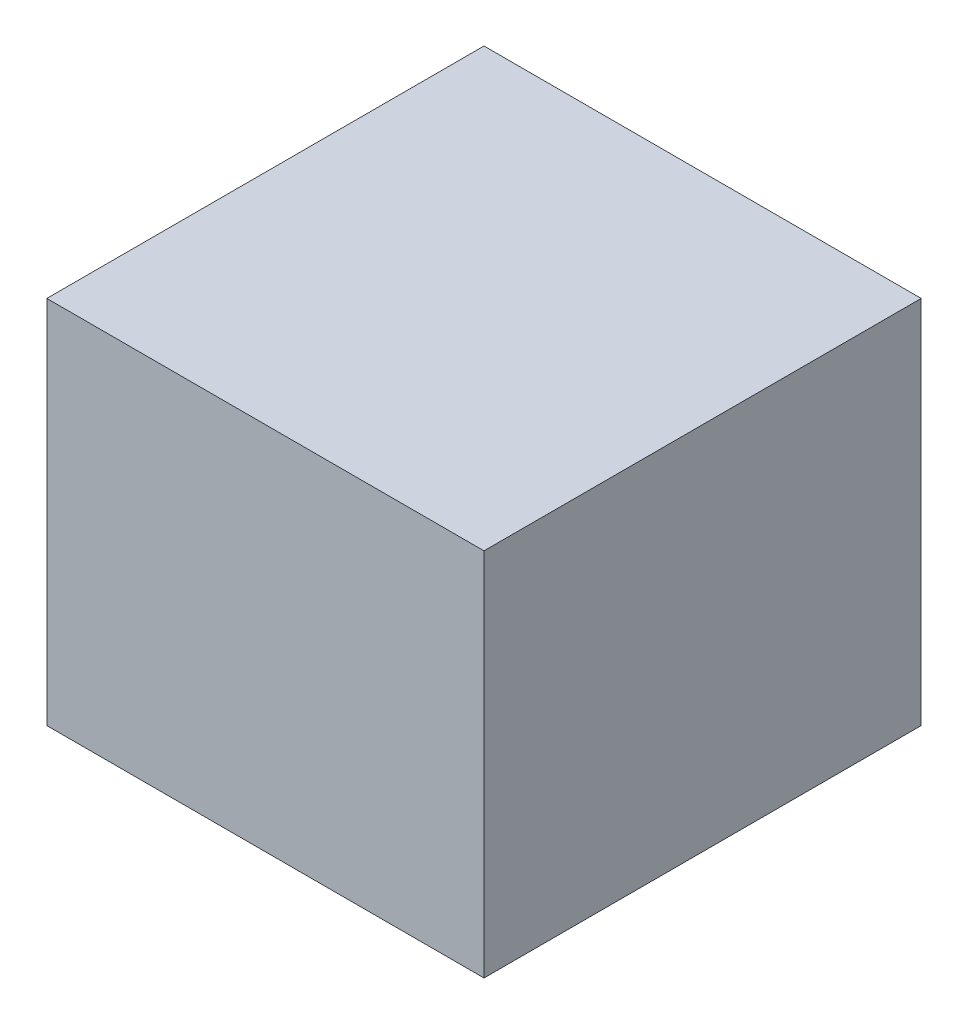
ISO-10303-21;
HEADER;
FILE_DESCRIPTION(('STEP AP214'),'2;1');
FILE_NAME('part.step','',(''),(''),'','','');
FILE_SCHEMA(('AUTOMOTIVE_DESIGN { 1 0 10303 214 1 1 1 1 }'));
ENDSEC;
DATA;
#1=APPLICATION_CONTEXT('core data for automotive mechanical design processes');
#2=APPLICATION_PROTOCOL_DEFINITION('international standard','automotive_design',2000,#1);
#3=PRODUCT_CONTEXT('',#1,'mechanical');
#4=PRODUCT('Part','Part','',(#3));
#5=PRODUCT_RELATED_PRODUCT_CATEGORY('part','',(#4));
#6=PRODUCT_DEFINITION_FORMATION('','',#4);
#7=PRODUCT_DEFINITION_CONTEXT('part definition',#1,'design');
#8=PRODUCT_DEFINITION('design','',#6,#7);
#9=PRODUCT_DEFINITION_SHAPE('','',#8);
#10=(LENGTH_UNIT() NAMED_UNIT(*) SI_UNIT(.MILLI.,.METRE.));
#11=(NAMED_UNIT(*) PLANE_ANGLE_UNIT() SI_UNIT($,.RADIAN.));
#12=(NAMED_UNIT(*) SI_UNIT($,.STERADIAN.) SOLID_ANGLE_UNIT());
#13=UNCERTAINTY_MEASURE_WITH_UNIT(LENGTH_MEASURE(1.E-05),#10,'distance_accuracy_value','');
#14=(GEOMETRIC_REPRESENTATION_CONTEXT(3) GLOBAL_UNCERTAINTY_ASSIGNED_CONTEXT((#13)) GLOBAL_UNIT_ASSIGNED_CONTEXT((#10,
#11,#12)) REPRESENTATION_CONTEXT('',''));
#15=CARTESIAN_POINT('',(0.,0.,0.));
#16=DIRECTION('',(0.,0.,1.));
#17=DIRECTION('',(1.,0.,0.));
#18=AXIS2_PLACEMENT_3D('',#15,#16,#17);
#19=CARTESIAN_POINT('',(0.,279.4,0.));
#20=DIRECTION('',(1.,0.,0.));
#21=DIRECTION('',(0.,0.,-1.));
#22=AXIS2_PLACEMENT_3D('',#19,#20,#21);
#23=PLANE('',#22);
#24=DIRECTION('',(0.,0.,1.));
#25=VECTOR('',#24,1.);
#26=CARTESIAN_POINT('',(0.,0.,0.));
#27=LINE('',#26,#25);
#28=CARTESIAN_POINT('',(0.,0.,-330.2));
#29=VERTEX_POINT('',#28);
#30=CARTESIAN_POINT('',(0.,0.,0.));
#31=VERTEX_POINT('',#30);
#32=EDGE_CURVE('E95',#29,#31,#27,.T.);
#33=ORIENTED_EDGE('',*,*,#32,.T.);
#34=DIRECTION('',(0.,-1.,0.));
#35=VECTOR('',#34,1.);
#36=CARTESIAN_POINT('',(0.,279.4,0.));
#37=LINE('',#36,#35);
#38=CARTESIAN_POINT('',(0.,279.4,0.));
#39=VERTEX_POINT('',#38);
#40=EDGE_CURVE('E11',#39,#31,#37,.T.);
#41=ORIENTED_EDGE('',*,*,#40,.F.);
#42=DIRECTION('',(0.,0.,1.));
#43=VECTOR('',#42,1.);
#44=CARTESIAN_POINT('',(0.,279.4,0.));
#45=LINE('',#44,#43);
#46=CARTESIAN_POINT('',(0.,279.4,-330.2));
#47=VERTEX_POINT('',#46);
#48=EDGE_CURVE('E83',#47,#39,#45,.T.);
#49=ORIENTED_EDGE('',*,*,#48,.F.);
#50=DIRECTION('',(0.,-1.,0.));
#51=VECTOR('',#50,1.);
#52=CARTESIAN_POINT('',(0.,279.4,-330.2));
#53=LINE('',#52,#51);
#54=EDGE_CURVE('E91',#47,#29,#53,.T.);
#55=ORIENTED_EDGE('',*,*,#54,.T.);
#56=EDGE_LOOP('',(#33,#41,#49,#55));
#57=FACE_BOUND('',#56,.T.);
#58=ADVANCED_FACE('F32',(#57),#23,.F.);
#59=CARTESIAN_POINT('',(0.,279.4,0.));
#60=DIRECTION('',(0.,0.,-1.));
#61=DIRECTION('',(-1.,0.,0.));
#62=AXIS2_PLACEMENT_3D('',#59,#60,#61);
#63=PLANE('',#62);
#64=DIRECTION('',(1.,0.,0.));
#65=VECTOR('',#64,1.);
#66=CARTESIAN_POINT('',(0.,0.,0.));
#67=LINE('',#66,#65);
#68=CARTESIAN_POINT('',(330.2,0.,0.));
#69=VERTEX_POINT('',#68);
#70=EDGE_CURVE('E87',#31,#69,#67,.T.);
#71=ORIENTED_EDGE('',*,*,#70,.T.);
#72=DIRECTION('',(0.,-1.,0.));
#73=VECTOR('',#72,1.);
#74=CARTESIAN_POINT('',(330.2,279.4,0.));
#75=LINE('',#74,#73);
#76=CARTESIAN_POINT('',(330.2,279.4,0.));
#77=VERTEX_POINT('',#76);
#78=EDGE_CURVE('E40',#77,#69,#75,.T.);
#79=ORIENTED_EDGE('',*,*,#78,.F.);
#80=DIRECTION('',(1.,0.,0.));
#81=VECTOR('',#80,1.);
#82=CARTESIAN_POINT('',(0.,279.4,0.));
#83=LINE('',#82,#81);
#84=EDGE_CURVE('E78',#39,#77,#83,.T.);
#85=ORIENTED_EDGE('',*,*,#84,.F.);
#86=ORIENTED_EDGE('',*,*,#40,.T.);
#87=EDGE_LOOP('',(#71,#79,#85,#86));
#88=FACE_BOUND('',#87,.T.);
#89=ADVANCED_FACE('F86',(#88),#63,.F.);
#90=CARTESIAN_POINT('',(330.2,279.4,0.));
#91=DIRECTION('',(-1.,0.,0.));
#92=DIRECTION('',(0.,0.,1.));
#93=AXIS2_PLACEMENT_3D('',#90,#91,#92);
#94=PLANE('',#93);
#95=DIRECTION('',(0.,0.,-1.));
#96=VECTOR('',#95,1.);
#97=CARTESIAN_POINT('',(330.2,0.,0.));
#98=LINE('',#97,#96);
#99=CARTESIAN_POINT('',(330.2,0.,-330.2));
#100=VERTEX_POINT('',#99);
#101=EDGE_CURVE('E65',#69,#100,#98,.T.);
#102=ORIENTED_EDGE('',*,*,#101,.T.);
#103=DIRECTION('',(0.,-1.,0.));
#104=VECTOR('',#103,1.);
#105=CARTESIAN_POINT('',(330.2,279.4,-330.2));
#106=LINE('',#105,#104);
#107=CARTESIAN_POINT('',(330.2,279.4,-330.2));
#108=VERTEX_POINT('',#107);
#109=EDGE_CURVE('E88',#108,#100,#106,.T.);
#110=ORIENTED_EDGE('',*,*,#109,.F.);
#111=DIRECTION('',(0.,0.,-1.));
#112=VECTOR('',#111,1.);
#113=CARTESIAN_POINT('',(330.2,279.4,0.));
#114=LINE('',#113,#112);
#115=EDGE_CURVE('E81',#77,#108,#114,.T.);
#116=ORIENTED_EDGE('',*,*,#115,.F.);
#117=ORIENTED_EDGE('',*,*,#78,.T.);
#118=EDGE_LOOP('',(#102,#110,#116,#117));
#119=FACE_BOUND('',#118,.T.);
#120=ADVANCED_FACE('F89',(#119),#94,.F.);
#121=CARTESIAN_POINT('',(0.,279.4,-330.2));
#122=DIRECTION('',(0.,0.,1.));
#123=DIRECTION('',(1.,0.,0.));
#124=AXIS2_PLACEMENT_3D('',#121,#122,#123);
#125=PLANE('',#124);
#126=DIRECTION('',(-1.,0.,0.));
#127=VECTOR('',#126,1.);
#128=CARTESIAN_POINT('',(0.,0.,-330.2));
#129=LINE('',#128,#127);
#130=EDGE_CURVE('E71',#100,#29,#129,.T.);
#131=ORIENTED_EDGE('',*,*,#130,.T.);
#132=ORIENTED_EDGE('',*,*,#54,.F.);
#133=DIRECTION('',(-1.,0.,0.));
#134=VECTOR('',#133,1.);
#135=CARTESIAN_POINT('',(0.,279.4,-330.2));
#136=LINE('',#135,#134);
#137=EDGE_CURVE('E48',#108,#47,#136,.T.);
#138=ORIENTED_EDGE('',*,*,#137,.F.);
#139=ORIENTED_EDGE('',*,*,#109,.T.);
#140=EDGE_LOOP('',(#131,#132,#138,#139));
#141=FACE_BOUND('',#140,.T.);
#142=ADVANCED_FACE('F102',(#141),#125,.F.);
#143=CARTESIAN_POINT('',(0.,279.4,0.));
#144=DIRECTION('',(0.,-1.,0.));
#145=DIRECTION('',(0.,0.,-1.));
#146=AXIS2_PLACEMENT_3D('',#143,#144,#145);
#147=PLANE('',#146);
#148=ORIENTED_EDGE('',*,*,#48,.T.);
#149=ORIENTED_EDGE('',*,*,#84,.T.);
#150=ORIENTED_EDGE('',*,*,#115,.T.);
#151=ORIENTED_EDGE('',*,*,#137,.T.);
#152=EDGE_LOOP('',(#148,#149,#150,#151));
#153=FACE_BOUND('',#152,.T.);
#154=ADVANCED_FACE('F79',(#153),#147,.F.);
#155=CARTESIAN_POINT('',(0.,0.,0.));
#156=DIRECTION('',(0.,-1.,0.));
#157=DIRECTION('',(0.,0.,-1.));
#158=AXIS2_PLACEMENT_3D('',#155,#156,#157);
#159=PLANE('',#158);
#160=ORIENTED_EDGE('',*,*,#32,.F.);
#161=ORIENTED_EDGE('',*,*,#130,.F.);
#162=ORIENTED_EDGE('',*,*,#101,.F.);
#163=ORIENTED_EDGE('',*,*,#70,.F.);
#164=EDGE_LOOP('',(#160,#161,#162,#163));
#165=FACE_BOUND('',#164,.T.);
#166=ADVANCED_FACE('F105',(#165),#159,.T.);
#167=CLOSED_SHELL('',(#58,#89,#120,#142,#154,#166));
#168=MANIFOLD_SOLID_BREP('B2',#167);
#169=ADVANCED_BREP_SHAPE_REPRESENTATION('',(#18,#168),#14);
#170=SHAPE_DEFINITION_REPRESENTATION(#9,#169);
ENDSEC;
END-ISO-10303-21;
